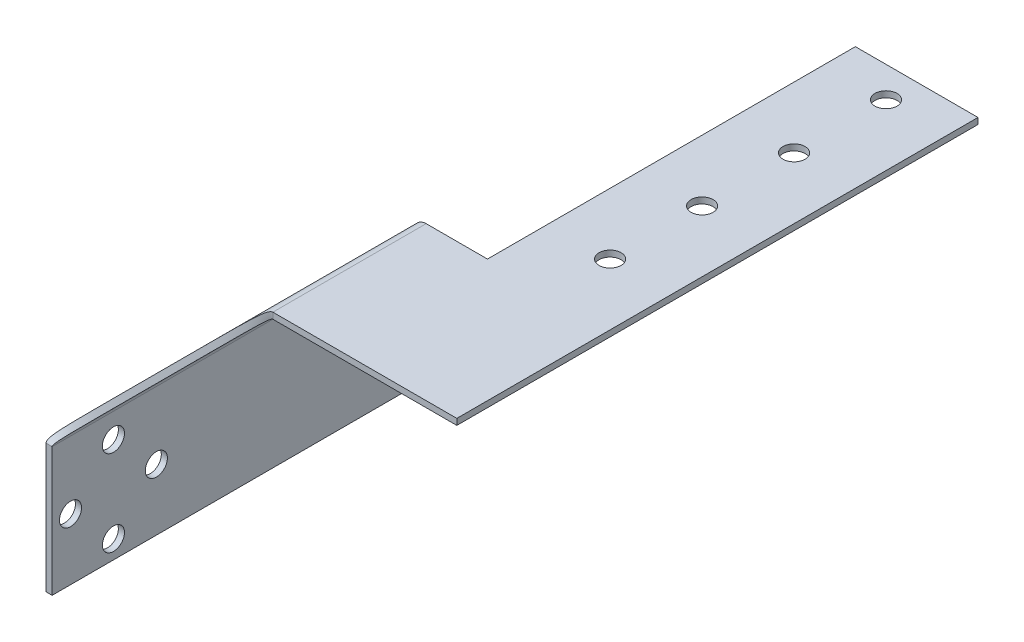
ISO-10303-21;
HEADER;
FILE_DESCRIPTION(('STEP AP214'),'2;1');
FILE_NAME('part.step','',(''),(''),'','','');
FILE_SCHEMA(('AUTOMOTIVE_DESIGN { 1 0 10303 214 1 1 1 1 }'));
ENDSEC;
DATA;
#1=APPLICATION_CONTEXT('core data for automotive mechanical design processes');
#2=APPLICATION_PROTOCOL_DEFINITION('international standard','automotive_design',2000,#1);
#3=PRODUCT_CONTEXT('',#1,'mechanical');
#4=PRODUCT('Part','Part','',(#3));
#5=PRODUCT_RELATED_PRODUCT_CATEGORY('part','',(#4));
#6=PRODUCT_DEFINITION_FORMATION('','',#4);
#7=PRODUCT_DEFINITION_CONTEXT('part definition',#1,'design');
#8=PRODUCT_DEFINITION('design','',#6,#7);
#9=PRODUCT_DEFINITION_SHAPE('','',#8);
#10=(LENGTH_UNIT() NAMED_UNIT(*) SI_UNIT(.MILLI.,.METRE.));
#11=(NAMED_UNIT(*) PLANE_ANGLE_UNIT() SI_UNIT($,.RADIAN.));
#12=(NAMED_UNIT(*) SI_UNIT($,.STERADIAN.) SOLID_ANGLE_UNIT());
#13=UNCERTAINTY_MEASURE_WITH_UNIT(LENGTH_MEASURE(1.E-05),#10,'distance_accuracy_value','');
#14=(GEOMETRIC_REPRESENTATION_CONTEXT(3) GLOBAL_UNCERTAINTY_ASSIGNED_CONTEXT((#13)) GLOBAL_UNIT_ASSIGNED_CONTEXT((#10,
#11,#12)) REPRESENTATION_CONTEXT('',''));
#15=CARTESIAN_POINT('',(0.,0.,0.));
#16=DIRECTION('',(0.,0.,1.));
#17=DIRECTION('',(1.,0.,0.));
#18=AXIS2_PLACEMENT_3D('',#15,#16,#17);
#19=CARTESIAN_POINT('',(0.,23.,-35.));
#20=DIRECTION('',(0.,0.,1.));
#21=DIRECTION('',(1.,0.,0.));
#22=AXIS2_PLACEMENT_3D('',#19,#20,#21);
#23=PLANE('',#22);
#24=CARTESIAN_POINT('',(2.,22.,-35.));
#25=CARTESIAN_POINT('',(2.,23.,-35.));
#26=B_SPLINE_CURVE_WITH_KNOTS('',1,(#24,#25),.UNSPECIFIED.,.F.,.F.,(2,2),(0.,1.),.UNSPECIFIED.);
#27=CARTESIAN_POINT('',(2.,22.,-35.));
#28=VERTEX_POINT('',#27);
#29=CARTESIAN_POINT('',(2.,23.,-35.));
#30=VERTEX_POINT('',#29);
#31=EDGE_CURVE('E12',#28,#30,#26,.T.);
#32=ORIENTED_EDGE('',*,*,#31,.F.);
#33=DIRECTION('',(1.,0.,0.));
#34=VECTOR('',#33,1.);
#35=CARTESIAN_POINT('',(0.,22.,-35.));
#36=LINE('',#35,#34);
#37=CARTESIAN_POINT('',(32.,22.,-35.));
#38=VERTEX_POINT('',#37);
#39=EDGE_CURVE('E271',#28,#38,#36,.T.);
#40=ORIENTED_EDGE('',*,*,#39,.T.);
#41=DIRECTION('',(0.,1.,0.));
#42=VECTOR('',#41,1.);
#43=CARTESIAN_POINT('',(32.,23.,-35.));
#44=LINE('',#43,#42);
#45=CARTESIAN_POINT('',(32.,23.,-35.));
#46=VERTEX_POINT('',#45);
#47=EDGE_CURVE('E65',#38,#46,#44,.T.);
#48=ORIENTED_EDGE('',*,*,#47,.T.);
#49=DIRECTION('',(1.,0.,0.));
#50=VECTOR('',#49,1.);
#51=CARTESIAN_POINT('',(0.,23.,-35.));
#52=LINE('',#51,#50);
#53=EDGE_CURVE('E290',#30,#46,#52,.T.);
#54=ORIENTED_EDGE('',*,*,#53,.F.);
#55=EDGE_LOOP('',(#32,#40,#48,#54));
#56=FACE_BOUND('',#55,.T.);
#57=ADVANCED_FACE('F53',(#56),#23,.T.);
#58=CARTESIAN_POINT('',(32.,23.,0.));
#59=DIRECTION('',(1.,0.,0.));
#60=DIRECTION('',(0.,0.,-1.));
#61=AXIS2_PLACEMENT_3D('',#58,#59,#60);
#62=PLANE('',#61);
#63=ORIENTED_EDGE('',*,*,#47,.F.);
#64=DIRECTION('',(0.,0.,1.));
#65=VECTOR('',#64,1.);
#66=CARTESIAN_POINT('',(32.,22.,0.));
#67=LINE('',#66,#65);
#68=CARTESIAN_POINT('',(32.,22.,-120.));
#69=VERTEX_POINT('',#68);
#70=EDGE_CURVE('E261',#38,#69,#67,.F.);
#71=ORIENTED_EDGE('',*,*,#70,.T.);
#72=DIRECTION('',(0.,1.,0.));
#73=VECTOR('',#72,1.);
#74=CARTESIAN_POINT('',(32.,23.,-120.));
#75=LINE('',#74,#73);
#76=CARTESIAN_POINT('',(32.,23.,-120.));
#77=VERTEX_POINT('',#76);
#78=EDGE_CURVE('E266',#69,#77,#75,.T.);
#79=ORIENTED_EDGE('',*,*,#78,.T.);
#80=DIRECTION('',(0.,0.,-1.));
#81=VECTOR('',#80,1.);
#82=CARTESIAN_POINT('',(32.,23.,0.));
#83=LINE('',#82,#81);
#84=EDGE_CURVE('E264',#46,#77,#83,.T.);
#85=ORIENTED_EDGE('',*,*,#84,.F.);
#86=EDGE_LOOP('',(#63,#71,#79,#85));
#87=FACE_BOUND('',#86,.T.);
#88=ADVANCED_FACE('F249',(#87),#62,.T.);
#89=CARTESIAN_POINT('',(0.,23.,-120.));
#90=DIRECTION('',(0.,0.,1.));
#91=DIRECTION('',(1.,0.,0.));
#92=AXIS2_PLACEMENT_3D('',#89,#90,#91);
#93=PLANE('',#92);
#94=ORIENTED_EDGE('',*,*,#78,.F.);
#95=DIRECTION('',(1.,0.,0.));
#96=VECTOR('',#95,1.);
#97=CARTESIAN_POINT('',(0.,22.,-120.));
#98=LINE('',#97,#96);
#99=CARTESIAN_POINT('',(12.,22.,-120.));
#100=VERTEX_POINT('',#99);
#101=EDGE_CURVE('E274',#100,#69,#98,.T.);
#102=ORIENTED_EDGE('',*,*,#101,.F.);
#103=DIRECTION('',(0.,1.,0.));
#104=VECTOR('',#103,1.);
#105=CARTESIAN_POINT('',(12.,23.,-120.));
#106=LINE('',#105,#104);
#107=CARTESIAN_POINT('',(12.,23.,-120.));
#108=VERTEX_POINT('',#107);
#109=EDGE_CURVE('E468',#100,#108,#106,.T.);
#110=ORIENTED_EDGE('',*,*,#109,.T.);
#111=DIRECTION('',(1.,0.,0.));
#112=VECTOR('',#111,1.);
#113=CARTESIAN_POINT('',(0.,23.,-120.));
#114=LINE('',#113,#112);
#115=EDGE_CURVE('E396',#108,#77,#114,.T.);
#116=ORIENTED_EDGE('',*,*,#115,.T.);
#117=EDGE_LOOP('',(#94,#102,#110,#116));
#118=FACE_BOUND('',#117,.T.);
#119=ADVANCED_FACE('F246',(#118),#93,.F.);
#120=CARTESIAN_POINT('',(12.,23.,0.));
#121=DIRECTION('',(1.,0.,0.));
#122=DIRECTION('',(0.,0.,-1.));
#123=AXIS2_PLACEMENT_3D('',#120,#121,#122);
#124=PLANE('',#123);
#125=ORIENTED_EDGE('',*,*,#109,.F.);
#126=DIRECTION('',(0.,0.,1.));
#127=VECTOR('',#126,1.);
#128=CARTESIAN_POINT('',(12.,22.,0.));
#129=LINE('',#128,#127);
#130=CARTESIAN_POINT('',(12.,22.,-60.));
#131=VERTEX_POINT('',#130);
#132=EDGE_CURVE('E278',#131,#100,#129,.F.);
#133=ORIENTED_EDGE('',*,*,#132,.F.);
#134=DIRECTION('',(0.,1.,0.));
#135=VECTOR('',#134,1.);
#136=CARTESIAN_POINT('',(12.,23.,-60.));
#137=LINE('',#136,#135);
#138=CARTESIAN_POINT('',(12.,23.,-60.));
#139=VERTEX_POINT('',#138);
#140=EDGE_CURVE('E466',#131,#139,#137,.T.);
#141=ORIENTED_EDGE('',*,*,#140,.T.);
#142=DIRECTION('',(0.,0.,-1.));
#143=VECTOR('',#142,1.);
#144=CARTESIAN_POINT('',(12.,23.,0.));
#145=LINE('',#144,#143);
#146=EDGE_CURVE('E382',#139,#108,#145,.T.);
#147=ORIENTED_EDGE('',*,*,#146,.T.);
#148=EDGE_LOOP('',(#125,#133,#141,#147));
#149=FACE_BOUND('',#148,.T.);
#150=ADVANCED_FACE('F242',(#149),#124,.F.);
#151=CARTESIAN_POINT('',(0.,23.,-60.));
#152=DIRECTION('',(0.,0.,1.));
#153=DIRECTION('',(1.,0.,0.));
#154=AXIS2_PLACEMENT_3D('',#151,#152,#153);
#155=PLANE('',#154);
#156=ORIENTED_EDGE('',*,*,#140,.F.);
#157=DIRECTION('',(1.,0.,0.));
#158=VECTOR('',#157,1.);
#159=CARTESIAN_POINT('',(0.,22.,-60.));
#160=LINE('',#159,#158);
#161=CARTESIAN_POINT('',(2.,22.,-60.));
#162=VERTEX_POINT('',#161);
#163=EDGE_CURVE('E276',#162,#131,#160,.T.);
#164=ORIENTED_EDGE('',*,*,#163,.F.);
#165=DIRECTION('',(0.,1.,0.));
#166=VECTOR('',#165,1.);
#167=CARTESIAN_POINT('',(2.,23.,-60.));
#168=LINE('',#167,#166);
#169=CARTESIAN_POINT('',(2.,23.,-60.));
#170=VERTEX_POINT('',#169);
#171=EDGE_CURVE('E469',#162,#170,#168,.T.);
#172=ORIENTED_EDGE('',*,*,#171,.T.);
#173=DIRECTION('',(1.,0.,0.));
#174=VECTOR('',#173,1.);
#175=CARTESIAN_POINT('',(0.,23.,-60.));
#176=LINE('',#175,#174);
#177=EDGE_CURVE('E386',#170,#139,#176,.T.);
#178=ORIENTED_EDGE('',*,*,#177,.T.);
#179=EDGE_LOOP('',(#156,#164,#172,#178));
#180=FACE_BOUND('',#179,.T.);
#181=ADVANCED_FACE('F239',(#180),#155,.F.);
#182=CARTESIAN_POINT('',(2.,21.,-60.));
#183=DIRECTION('',(0.,0.,-1.));
#184=DIRECTION('',(-1.,0.,0.));
#185=AXIS2_PLACEMENT_3D('',#182,#183,#184);
#186=PLANE('',#185);
#187=ORIENTED_EDGE('',*,*,#171,.F.);
#188=CARTESIAN_POINT('',(2.,21.,-60.));
#189=DIRECTION('',(0.,0.,-1.));
#190=DIRECTION('',(-1.,0.,0.));
#191=AXIS2_PLACEMENT_3D('',#188,#189,#190);
#192=CIRCLE('',#191,1.);
#193=CARTESIAN_POINT('',(1.,21.,-60.));
#194=VERTEX_POINT('',#193);
#195=EDGE_CURVE('E151',#162,#194,#192,.F.);
#196=ORIENTED_EDGE('',*,*,#195,.T.);
#197=DIRECTION('',(-1.,0.,0.));
#198=VECTOR('',#197,1.);
#199=CARTESIAN_POINT('',(0.,21.,-60.));
#200=LINE('',#199,#198);
#201=CARTESIAN_POINT('',(0.,21.,-60.));
#202=VERTEX_POINT('',#201);
#203=EDGE_CURVE('E73',#194,#202,#200,.T.);
#204=ORIENTED_EDGE('',*,*,#203,.T.);
#205=CARTESIAN_POINT('',(2.,21.,-60.));
#206=DIRECTION('',(0.,0.,1.));
#207=DIRECTION('',(1.,0.,0.));
#208=AXIS2_PLACEMENT_3D('',#205,#206,#207);
#209=CIRCLE('',#208,2.);
#210=EDGE_CURVE('E417',#170,#202,#209,.T.);
#211=ORIENTED_EDGE('',*,*,#210,.F.);
#212=EDGE_LOOP('',(#187,#196,#204,#211));
#213=FACE_BOUND('',#212,.T.);
#214=ADVANCED_FACE('F235',(#213),#186,.T.);
#215=CARTESIAN_POINT('',(0.,22.,-60.));
#216=DIRECTION('',(0.,0.,1.));
#217=DIRECTION('',(0.,-1.,0.));
#218=AXIS2_PLACEMENT_3D('',#215,#216,#217);
#219=PLANE('',#218);
#220=ORIENTED_EDGE('',*,*,#203,.F.);
#221=DIRECTION('',(0.,1.,0.));
#222=VECTOR('',#221,1.);
#223=CARTESIAN_POINT('',(1.,22.,-60.));
#224=LINE('',#223,#222);
#225=CARTESIAN_POINT('',(1.,0.,-60.));
#226=VERTEX_POINT('',#225);
#227=EDGE_CURVE('E142',#194,#226,#224,.F.);
#228=ORIENTED_EDGE('',*,*,#227,.T.);
#229=DIRECTION('',(-1.,0.,0.));
#230=VECTOR('',#229,1.);
#231=CARTESIAN_POINT('',(0.,0.,-60.));
#232=LINE('',#231,#230);
#233=CARTESIAN_POINT('',(0.,0.,-60.));
#234=VERTEX_POINT('',#233);
#235=EDGE_CURVE('E454',#226,#234,#232,.T.);
#236=ORIENTED_EDGE('',*,*,#235,.T.);
#237=DIRECTION('',(0.,-1.,0.));
#238=VECTOR('',#237,1.);
#239=CARTESIAN_POINT('',(0.,22.,-60.));
#240=LINE('',#239,#238);
#241=EDGE_CURVE('E413',#202,#234,#240,.T.);
#242=ORIENTED_EDGE('',*,*,#241,.F.);
#243=EDGE_LOOP('',(#220,#228,#236,#242));
#244=FACE_BOUND('',#243,.T.);
#245=ADVANCED_FACE('F231',(#244),#219,.F.);
#246=CARTESIAN_POINT('',(0.,0.,0.));
#247=DIRECTION('',(0.,1.,0.));
#248=DIRECTION('',(0.,0.,1.));
#249=AXIS2_PLACEMENT_3D('',#246,#247,#248);
#250=PLANE('',#249);
#251=ORIENTED_EDGE('',*,*,#235,.F.);
#252=DIRECTION('',(0.,0.,-1.));
#253=VECTOR('',#252,1.);
#254=CARTESIAN_POINT('',(1.,0.,0.));
#255=LINE('',#254,#253);
#256=CARTESIAN_POINT('',(1.,0.,0.));
#257=VERTEX_POINT('',#256);
#258=EDGE_CURVE('E156',#226,#257,#255,.F.);
#259=ORIENTED_EDGE('',*,*,#258,.T.);
#260=DIRECTION('',(-1.,0.,0.));
#261=VECTOR('',#260,1.);
#262=CARTESIAN_POINT('',(0.,0.,0.));
#263=LINE('',#262,#261);
#264=CARTESIAN_POINT('',(0.,0.,0.));
#265=VERTEX_POINT('',#264);
#266=EDGE_CURVE('E129',#257,#265,#263,.T.);
#267=ORIENTED_EDGE('',*,*,#266,.T.);
#268=DIRECTION('',(0.,0.,1.));
#269=VECTOR('',#268,1.);
#270=CARTESIAN_POINT('',(0.,0.,0.));
#271=LINE('',#270,#269);
#272=EDGE_CURVE('E409',#234,#265,#271,.T.);
#273=ORIENTED_EDGE('',*,*,#272,.F.);
#274=EDGE_LOOP('',(#251,#259,#267,#273));
#275=FACE_BOUND('',#274,.T.);
#276=ADVANCED_FACE('F227',(#275),#250,.F.);
#277=CARTESIAN_POINT('',(0.,22.,0.));
#278=DIRECTION('',(0.,0.,1.));
#279=DIRECTION('',(0.,-1.,0.));
#280=AXIS2_PLACEMENT_3D('',#277,#278,#279);
#281=PLANE('',#280);
#282=ORIENTED_EDGE('',*,*,#266,.F.);
#283=DIRECTION('',(0.,1.,0.));
#284=VECTOR('',#283,1.);
#285=CARTESIAN_POINT('',(1.,22.,0.));
#286=LINE('',#285,#284);
#287=CARTESIAN_POINT('',(1.,21.,0.));
#288=VERTEX_POINT('',#287);
#289=EDGE_CURVE('E139',#288,#257,#286,.F.);
#290=ORIENTED_EDGE('',*,*,#289,.F.);
#291=CARTESIAN_POINT('',(0.,21.,0.));
#292=CARTESIAN_POINT('',(1.,21.,0.));
#293=B_SPLINE_CURVE_WITH_KNOTS('',1,(#291,#292),.UNSPECIFIED.,.F.,.F.,(2,2),(0.,1.),.UNSPECIFIED.);
#294=CARTESIAN_POINT('',(0.,21.,0.));
#295=VERTEX_POINT('',#294);
#296=EDGE_CURVE('E114',#288,#295,#293,.F.);
#297=ORIENTED_EDGE('',*,*,#296,.T.);
#298=DIRECTION('',(0.,-1.,0.));
#299=VECTOR('',#298,1.);
#300=CARTESIAN_POINT('',(0.,22.,0.));
#301=LINE('',#300,#299);
#302=EDGE_CURVE('E412',#295,#265,#301,.T.);
#303=ORIENTED_EDGE('',*,*,#302,.T.);
#304=EDGE_LOOP('',(#282,#290,#297,#303));
#305=FACE_BOUND('',#304,.T.);
#306=ADVANCED_FACE('F154',(#305),#281,.T.);
#307=CARTESIAN_POINT('',(22.,23.,-115.));
#308=DIRECTION('',(0.,1.,0.));
#309=DIRECTION('',(0.,0.,1.));
#310=AXIS2_PLACEMENT_3D('',#307,#308,#309);
#311=CYLINDRICAL_SURFACE('',#310,1.8);
#312=CARTESIAN_POINT('',(22.,23.,-115.));
#313=DIRECTION('',(0.,1.,0.));
#314=DIRECTION('',(0.,0.,1.));
#315=AXIS2_PLACEMENT_3D('',#312,#313,#314);
#316=CIRCLE('',#315,1.8);
#317=CARTESIAN_POINT('',(22.,23.,-113.2));
#318=VERTEX_POINT('',#317);
#319=EDGE_CURVE('E418',#318,#318,#316,.T.);
#320=ORIENTED_EDGE('',*,*,#319,.T.);
#321=EDGE_LOOP('',(#320));
#322=FACE_BOUND('',#321,.T.);
#323=CARTESIAN_POINT('',(22.,22.,-115.));
#324=DIRECTION('',(0.,1.,0.));
#325=DIRECTION('',(0.,0.,1.));
#326=AXIS2_PLACEMENT_3D('',#323,#324,#325);
#327=CIRCLE('',#326,1.8);
#328=CARTESIAN_POINT('',(22.,22.,-113.2));
#329=VERTEX_POINT('',#328);
#330=EDGE_CURVE('E353',#329,#329,#327,.T.);
#331=ORIENTED_EDGE('',*,*,#330,.F.);
#332=EDGE_LOOP('',(#331));
#333=FACE_BOUND('',#332,.T.);
#334=ADVANCED_FACE('F184',(#322,#333),#311,.F.);
#335=CARTESIAN_POINT('',(22.,23.,-100.));
#336=DIRECTION('',(0.,1.,0.));
#337=DIRECTION('',(0.,0.,1.));
#338=AXIS2_PLACEMENT_3D('',#335,#336,#337);
#339=CYLINDRICAL_SURFACE('',#338,1.8);
#340=CARTESIAN_POINT('',(22.,23.,-100.));
#341=DIRECTION('',(0.,1.,0.));
#342=DIRECTION('',(0.,0.,1.));
#343=AXIS2_PLACEMENT_3D('',#340,#341,#342);
#344=CIRCLE('',#343,1.8);
#345=CARTESIAN_POINT('',(22.,23.,-98.2));
#346=VERTEX_POINT('',#345);
#347=EDGE_CURVE('E389',#346,#346,#344,.T.);
#348=ORIENTED_EDGE('',*,*,#347,.T.);
#349=EDGE_LOOP('',(#348));
#350=FACE_BOUND('',#349,.T.);
#351=CARTESIAN_POINT('',(22.,22.,-100.));
#352=DIRECTION('',(0.,1.,0.));
#353=DIRECTION('',(0.,0.,1.));
#354=AXIS2_PLACEMENT_3D('',#351,#352,#353);
#355=CIRCLE('',#354,1.8);
#356=CARTESIAN_POINT('',(22.,22.,-98.2));
#357=VERTEX_POINT('',#356);
#358=EDGE_CURVE('E360',#357,#357,#355,.T.);
#359=ORIENTED_EDGE('',*,*,#358,.F.);
#360=EDGE_LOOP('',(#359));
#361=FACE_BOUND('',#360,.T.);
#362=ADVANCED_FACE('F376',(#350,#361),#339,.F.);
#363=CARTESIAN_POINT('',(22.,23.,-85.));
#364=DIRECTION('',(0.,1.,0.));
#365=DIRECTION('',(0.,0.,1.));
#366=AXIS2_PLACEMENT_3D('',#363,#364,#365);
#367=CYLINDRICAL_SURFACE('',#366,1.80000000000001);
#368=CARTESIAN_POINT('',(22.,23.,-85.));
#369=DIRECTION('',(0.,1.,0.));
#370=DIRECTION('',(0.,0.,1.));
#371=AXIS2_PLACEMENT_3D('',#368,#369,#370);
#372=CIRCLE('',#371,1.80000000000001);
#373=CARTESIAN_POINT('',(22.,23.,-83.2));
#374=VERTEX_POINT('',#373);
#375=EDGE_CURVE('E383',#374,#374,#372,.T.);
#376=ORIENTED_EDGE('',*,*,#375,.T.);
#377=EDGE_LOOP('',(#376));
#378=FACE_BOUND('',#377,.T.);
#379=CARTESIAN_POINT('',(22.,22.,-85.));
#380=DIRECTION('',(0.,1.,0.));
#381=DIRECTION('',(0.,0.,1.));
#382=AXIS2_PLACEMENT_3D('',#379,#380,#381);
#383=CIRCLE('',#382,1.80000000000001);
#384=CARTESIAN_POINT('',(22.,22.,-83.2));
#385=VERTEX_POINT('',#384);
#386=EDGE_CURVE('E363',#385,#385,#383,.T.);
#387=ORIENTED_EDGE('',*,*,#386,.F.);
#388=EDGE_LOOP('',(#387));
#389=FACE_BOUND('',#388,.T.);
#390=ADVANCED_FACE('F371',(#378,#389),#367,.F.);
#391=CARTESIAN_POINT('',(22.,23.,-70.));
#392=DIRECTION('',(0.,1.,0.));
#393=DIRECTION('',(0.,0.,1.));
#394=AXIS2_PLACEMENT_3D('',#391,#392,#393);
#395=CYLINDRICAL_SURFACE('',#394,1.8);
#396=CARTESIAN_POINT('',(22.,23.,-70.));
#397=DIRECTION('',(0.,1.,0.));
#398=DIRECTION('',(0.,0.,1.));
#399=AXIS2_PLACEMENT_3D('',#396,#397,#398);
#400=CIRCLE('',#399,1.8);
#401=CARTESIAN_POINT('',(22.,23.,-68.2));
#402=VERTEX_POINT('',#401);
#403=EDGE_CURVE('E380',#402,#402,#400,.T.);
#404=ORIENTED_EDGE('',*,*,#403,.T.);
#405=EDGE_LOOP('',(#404));
#406=FACE_BOUND('',#405,.T.);
#407=CARTESIAN_POINT('',(22.,22.,-70.));
#408=DIRECTION('',(0.,1.,0.));
#409=DIRECTION('',(0.,0.,1.));
#410=AXIS2_PLACEMENT_3D('',#407,#408,#409);
#411=CIRCLE('',#410,1.8);
#412=CARTESIAN_POINT('',(22.,22.,-68.2));
#413=VERTEX_POINT('',#412);
#414=EDGE_CURVE('E356',#413,#413,#411,.T.);
#415=ORIENTED_EDGE('',*,*,#414,.F.);
#416=EDGE_LOOP('',(#415));
#417=FACE_BOUND('',#416,.T.);
#418=ADVANCED_FACE('F55',(#406,#417),#395,.F.);
#419=CARTESIAN_POINT('',(0.,17.,-9.99999999999999));
#420=DIRECTION('',(1.,0.,0.));
#421=DIRECTION('',(0.,0.,-1.));
#422=AXIS2_PLACEMENT_3D('',#419,#420,#421);
#423=CYLINDRICAL_SURFACE('',#422,1.8);
#424=CARTESIAN_POINT('',(0.,17.,-9.99999999999999));
#425=DIRECTION('',(-1.,0.,0.));
#426=DIRECTION('',(0.,0.,1.));
#427=AXIS2_PLACEMENT_3D('',#424,#425,#426);
#428=CIRCLE('',#427,1.8);
#429=CARTESIAN_POINT('',(0.,17.,-8.2));
#430=VERTEX_POINT('',#429);
#431=EDGE_CURVE('E399',#430,#430,#428,.T.);
#432=ORIENTED_EDGE('',*,*,#431,.T.);
#433=EDGE_LOOP('',(#432));
#434=FACE_BOUND('',#433,.T.);
#435=CARTESIAN_POINT('',(1.,17.,-9.99999999999999));
#436=DIRECTION('',(-1.,0.,0.));
#437=DIRECTION('',(0.,0.,1.));
#438=AXIS2_PLACEMENT_3D('',#435,#436,#437);
#439=CIRCLE('',#438,1.8);
#440=CARTESIAN_POINT('',(1.,17.,-8.2));
#441=VERTEX_POINT('',#440);
#442=EDGE_CURVE('E349',#441,#441,#439,.T.);
#443=ORIENTED_EDGE('',*,*,#442,.F.);
#444=EDGE_LOOP('',(#443));
#445=FACE_BOUND('',#444,.T.);
#446=ADVANCED_FACE('F322',(#434,#445),#423,.F.);
#447=CARTESIAN_POINT('',(0.,10.,-17.));
#448=DIRECTION('',(1.,0.,0.));
#449=DIRECTION('',(0.,0.,-1.));
#450=AXIS2_PLACEMENT_3D('',#447,#448,#449);
#451=CYLINDRICAL_SURFACE('',#450,1.8);
#452=CARTESIAN_POINT('',(0.,10.,-17.));
#453=DIRECTION('',(-1.,0.,0.));
#454=DIRECTION('',(0.,0.,1.));
#455=AXIS2_PLACEMENT_3D('',#452,#453,#454);
#456=CIRCLE('',#455,1.8);
#457=CARTESIAN_POINT('',(0.,10.,-15.2));
#458=VERTEX_POINT('',#457);
#459=EDGE_CURVE('E402',#458,#458,#456,.T.);
#460=ORIENTED_EDGE('',*,*,#459,.T.);
#461=EDGE_LOOP('',(#460));
#462=FACE_BOUND('',#461,.T.);
#463=CARTESIAN_POINT('',(1.,10.,-17.));
#464=DIRECTION('',(-1.,0.,0.));
#465=DIRECTION('',(0.,0.,1.));
#466=AXIS2_PLACEMENT_3D('',#463,#464,#465);
#467=CIRCLE('',#466,1.8);
#468=CARTESIAN_POINT('',(1.,10.,-15.2));
#469=VERTEX_POINT('',#468);
#470=EDGE_CURVE('E344',#469,#469,#467,.T.);
#471=ORIENTED_EDGE('',*,*,#470,.F.);
#472=EDGE_LOOP('',(#471));
#473=FACE_BOUND('',#472,.T.);
#474=ADVANCED_FACE('F325',(#462,#473),#451,.F.);
#475=CARTESIAN_POINT('',(0.,10.,-3.));
#476=DIRECTION('',(1.,0.,0.));
#477=DIRECTION('',(0.,0.,-1.));
#478=AXIS2_PLACEMENT_3D('',#475,#476,#477);
#479=CYLINDRICAL_SURFACE('',#478,1.8);
#480=CARTESIAN_POINT('',(0.,10.,-3.));
#481=DIRECTION('',(-1.,0.,0.));
#482=DIRECTION('',(0.,0.,1.));
#483=AXIS2_PLACEMENT_3D('',#480,#481,#482);
#484=CIRCLE('',#483,1.8);
#485=CARTESIAN_POINT('',(0.,10.,-1.2));
#486=VERTEX_POINT('',#485);
#487=EDGE_CURVE('E339',#486,#486,#484,.T.);
#488=ORIENTED_EDGE('',*,*,#487,.T.);
#489=EDGE_LOOP('',(#488));
#490=FACE_BOUND('',#489,.T.);
#491=CARTESIAN_POINT('',(1.,10.,-3.));
#492=DIRECTION('',(-1.,0.,0.));
#493=DIRECTION('',(0.,0.,1.));
#494=AXIS2_PLACEMENT_3D('',#491,#492,#493);
#495=CIRCLE('',#494,1.8);
#496=CARTESIAN_POINT('',(1.,10.,-1.2));
#497=VERTEX_POINT('',#496);
#498=EDGE_CURVE('E342',#497,#497,#495,.T.);
#499=ORIENTED_EDGE('',*,*,#498,.F.);
#500=EDGE_LOOP('',(#499));
#501=FACE_BOUND('',#500,.T.);
#502=ADVANCED_FACE('F328',(#490,#501),#479,.F.);
#503=CARTESIAN_POINT('',(0.,3.,-9.99999999999999));
#504=DIRECTION('',(1.,0.,0.));
#505=DIRECTION('',(0.,0.,-1.));
#506=AXIS2_PLACEMENT_3D('',#503,#504,#505);
#507=CYLINDRICAL_SURFACE('',#506,1.8);
#508=CARTESIAN_POINT('',(0.,3.,-9.99999999999999));
#509=DIRECTION('',(-1.,0.,0.));
#510=DIRECTION('',(0.,0.,1.));
#511=AXIS2_PLACEMENT_3D('',#508,#509,#510);
#512=CIRCLE('',#511,1.8);
#513=CARTESIAN_POINT('',(0.,3.,-8.19999999999999));
#514=VERTEX_POINT('',#513);
#515=EDGE_CURVE('E406',#514,#514,#512,.T.);
#516=ORIENTED_EDGE('',*,*,#515,.T.);
#517=EDGE_LOOP('',(#516));
#518=FACE_BOUND('',#517,.T.);
#519=CARTESIAN_POINT('',(1.,3.,-9.99999999999999));
#520=DIRECTION('',(-1.,0.,0.));
#521=DIRECTION('',(0.,0.,1.));
#522=AXIS2_PLACEMENT_3D('',#519,#520,#521);
#523=CIRCLE('',#522,1.8);
#524=CARTESIAN_POINT('',(1.,3.,-8.19999999999999));
#525=VERTEX_POINT('',#524);
#526=EDGE_CURVE('E159',#525,#525,#523,.T.);
#527=ORIENTED_EDGE('',*,*,#526,.F.);
#528=EDGE_LOOP('',(#527));
#529=FACE_BOUND('',#528,.T.);
#530=ADVANCED_FACE('F181',(#518,#529),#507,.F.);
#531=CARTESIAN_POINT('',(2.,23.,-35.));
#532=CARTESIAN_POINT('',(1.80338647388107,23.,-35.));
#533=CARTESIAN_POINT('',(1.6326093773315,22.9717056764427,-34.86328125));
#534=CARTESIAN_POINT('',(1.34199589270873,22.8946318214706,-34.3505859375));
#535=CARTESIAN_POINT('',(1.22202307719847,22.8457926109763,-33.974609375));
#536=CARTESIAN_POINT('',(1.02351196864741,22.7489052517995,-33.017578125));
#537=CARTESIAN_POINT('',(0.944794725634698,22.7007129597894,-32.4365234375));
#538=CARTESIAN_POINT('',(0.817642426928758,22.614903499298,-31.103515625));
#539=CARTESIAN_POINT('',(0.769158493570091,22.5771616142413,-30.3515625));
#540=CARTESIAN_POINT('',(0.655323307877943,22.4837394916937,-27.890625));
#541=CARTESIAN_POINT('',(0.620814178546581,22.4486023825566,-25.9765625));
#542=CARTESIAN_POINT('',(0.585680823817528,22.4143209185787,-21.875));
#543=CARTESIAN_POINT('',(0.585786437626905,22.4142135623731,-19.6875));
#544=CARTESIAN_POINT('',(0.585786437626905,22.4142135623731,-15.3125));
#545=CARTESIAN_POINT('',(0.585679081421307,22.4143191761825,-13.125));
#546=CARTESIAN_POINT('',(0.551397617443419,22.3791858214534,-9.0234375));
#547=CARTESIAN_POINT('',(0.516260508306251,22.3446766921221,-7.109375));
#548=CARTESIAN_POINT('',(0.422838385758663,22.2308415064299,-4.6484375));
#549=CARTESIAN_POINT('',(0.38509650070195,22.1823575730712,-3.896484375));
#550=CARTESIAN_POINT('',(0.299287040210591,22.0552052743653,-2.5634765625));
#551=CARTESIAN_POINT('',(0.251094748200532,21.9764880313526,-1.982421875));
#552=CARTESIAN_POINT('',(0.154207389023653,21.7779769228015,-1.025390625));
#553=CARTESIAN_POINT('',(0.105368178529392,21.6580041072913,-0.6494140625));
#554=CARTESIAN_POINT('',(0.0282943235572756,21.3673906226685,-0.13671875));
#555=CARTESIAN_POINT('',(0.,21.1966135261189,0.));
#556=CARTESIAN_POINT('',(0.,21.,0.));
#557=CARTESIAN_POINT('',(2.,22.,-35.));
#558=CARTESIAN_POINT('',(1.90169323694054,22.,-35.));
#559=CARTESIAN_POINT('',(1.81630468866575,21.9858528382214,-34.86328125));
#560=CARTESIAN_POINT('',(1.67099794635437,21.9473159107353,-34.3505859375));
#561=CARTESIAN_POINT('',(1.61101153859924,21.9228963054882,-33.974609375));
#562=CARTESIAN_POINT('',(1.51175598432371,21.8744526258997,-33.017578125));
#563=CARTESIAN_POINT('',(1.47239736281735,21.8503564798947,-32.4365234375));
#564=CARTESIAN_POINT('',(1.40882121346438,21.807451749649,-31.103515625));
#565=CARTESIAN_POINT('',(1.38457924678505,21.7885808071207,-30.3515625));
#566=CARTESIAN_POINT('',(1.32766165393897,21.7418697458469,-27.890625));
#567=CARTESIAN_POINT('',(1.31040708927329,21.7243011912783,-25.9765625));
#568=CARTESIAN_POINT('',(1.29284041190876,21.7071604592893,-21.875));
#569=CARTESIAN_POINT('',(1.29289321881345,21.7071067811865,-19.6875));
#570=CARTESIAN_POINT('',(1.29289321881345,21.7071067811865,-15.3125));
#571=CARTESIAN_POINT('',(1.29283954071065,21.7071595880912,-13.125));
#572=CARTESIAN_POINT('',(1.27569880872171,21.6895929107267,-9.0234375));
#573=CARTESIAN_POINT('',(1.25813025415313,21.672338346061,-7.109375));
#574=CARTESIAN_POINT('',(1.21141919287933,21.615420753215,-4.6484375));
#575=CARTESIAN_POINT('',(1.19254825035097,21.5911787865356,-3.896484375));
#576=CARTESIAN_POINT('',(1.1496435201053,21.5276026371826,-2.5634765625));
#577=CARTESIAN_POINT('',(1.12554737410027,21.4882440156763,-1.982421875));
#578=CARTESIAN_POINT('',(1.07710369451183,21.3889884614008,-1.025390625));
#579=CARTESIAN_POINT('',(1.0526840892647,21.3290020536456,-0.6494140625));
#580=CARTESIAN_POINT('',(1.01414716177864,21.1836953113342,-0.13671875));
#581=CARTESIAN_POINT('',(1.,21.0983067630595,0.));
#582=CARTESIAN_POINT('',(1.,21.,0.));
#583=B_SPLINE_SURFACE_WITH_KNOTS('',1,3,((#531,#532,#533,#534,#535,#536,#537,#538,#539,#540,
#541,#542,#543,#544,#545,#546,#547,#548,#549,#550,#551,#552,#553,#554,#555,#556),(#557,#558,
#559,#560,#561,#562,#563,#564,#565,#566,#567,#568,#569,#570,#571,#572,#573,#574,#575,#576,#577,
#578,#579,#580,#581,#582)),.UNSPECIFIED.,.F.,.F.,.F.,(2,2),(4,2,2,2,2,2,2,2,2,2,2,2,4),(0.,1.),
(0.,0.0625,0.125,0.1875,0.25,0.375,0.5,0.625,0.75,0.8125,0.875,0.9375,1.),.UNSPECIFIED.);
#584=CARTESIAN_POINT('',(1.,21.,0.));
#585=CARTESIAN_POINT('',(1.,21.0983067630595,0.));
#586=CARTESIAN_POINT('',(1.01414716177864,21.1836953113342,-0.13671875));
#587=CARTESIAN_POINT('',(1.0526840892647,21.3290020536456,-0.6494140625));
#588=CARTESIAN_POINT('',(1.07710369451183,21.3889884614008,-1.025390625));
#589=CARTESIAN_POINT('',(1.12554737410027,21.4882440156763,-1.982421875));
#590=CARTESIAN_POINT('',(1.1496435201053,21.5276026371826,-2.5634765625));
#591=CARTESIAN_POINT('',(1.19254825035097,21.5911787865356,-3.896484375));
#592=CARTESIAN_POINT('',(1.21141919287933,21.615420753215,-4.6484375));
#593=CARTESIAN_POINT('',(1.25813025415313,21.672338346061,-7.109375));
#594=CARTESIAN_POINT('',(1.27569880872171,21.6895929107267,-9.0234375));
#595=CARTESIAN_POINT('',(1.29283954071065,21.7071595880912,-13.125));
#596=CARTESIAN_POINT('',(1.29289321881345,21.7071067811865,-15.3125));
#597=CARTESIAN_POINT('',(1.29289321881345,21.7071067811865,-19.6875));
#598=CARTESIAN_POINT('',(1.29284041190876,21.7071604592893,-21.875));
#599=CARTESIAN_POINT('',(1.31040708927329,21.7243011912783,-25.9765625));
#600=CARTESIAN_POINT('',(1.32766165393897,21.7418697458469,-27.890625));
#601=CARTESIAN_POINT('',(1.38457924678505,21.7885808071207,-30.3515625));
#602=CARTESIAN_POINT('',(1.40882121346438,21.807451749649,-31.103515625));
#603=CARTESIAN_POINT('',(1.47239736281735,21.8503564798947,-32.4365234375));
#604=CARTESIAN_POINT('',(1.51175598432371,21.8744526258997,-33.017578125));
#605=CARTESIAN_POINT('',(1.61101153859924,21.9228963054882,-33.974609375));
#606=CARTESIAN_POINT('',(1.67099794635437,21.9473159107353,-34.3505859375));
#607=CARTESIAN_POINT('',(1.81630468866575,21.9858528382214,-34.86328125));
#608=CARTESIAN_POINT('',(1.90169323694054,22.,-35.));
#609=CARTESIAN_POINT('',(2.,22.,-35.));
#610=B_SPLINE_CURVE_WITH_KNOTS('',3,(#584,#585,#586,#587,#588,#589,#590,#591,#592,#593,#594,
#595,#596,#597,#598,#599,#600,#601,#602,#603,#604,#605,#606,#607,#608,#609),.UNSPECIFIED.,.F.,
.F.,(4,2,2,2,2,2,2,2,2,2,2,2,4),(0.,0.0625,0.125,0.1875,0.25,0.375,0.5,0.625,0.75,0.8125,0.875,
0.9375,1.),.UNSPECIFIED.);
#611=EDGE_CURVE('E118',#288,#28,#610,.T.);
#612=CARTESIAN_POINT('',(2.,23.,-35.));
#613=CARTESIAN_POINT('',(1.80338647388107,23.,-35.));
#614=CARTESIAN_POINT('',(1.6326093773315,22.9717056764427,-34.86328125));
#615=CARTESIAN_POINT('',(1.34199589270873,22.8946318214706,-34.3505859375));
#616=CARTESIAN_POINT('',(1.22202307719847,22.8457926109763,-33.974609375));
#617=CARTESIAN_POINT('',(1.02351196864741,22.7489052517995,-33.017578125));
#618=CARTESIAN_POINT('',(0.944794725634698,22.7007129597894,-32.4365234375));
#619=CARTESIAN_POINT('',(0.817642426928758,22.614903499298,-31.103515625));
#620=CARTESIAN_POINT('',(0.769158493570091,22.5771616142413,-30.3515625));
#621=CARTESIAN_POINT('',(0.655323307877943,22.4837394916937,-27.890625));
#622=CARTESIAN_POINT('',(0.620814178546581,22.4486023825566,-25.9765625));
#623=CARTESIAN_POINT('',(0.585680823817528,22.4143209185787,-21.875));
#624=CARTESIAN_POINT('',(0.585786437626905,22.4142135623731,-19.6875));
#625=CARTESIAN_POINT('',(0.585786437626905,22.4142135623731,-15.3125));
#626=CARTESIAN_POINT('',(0.585679081421307,22.4143191761825,-13.125));
#627=CARTESIAN_POINT('',(0.551397617443419,22.3791858214534,-9.0234375));
#628=CARTESIAN_POINT('',(0.516260508306251,22.3446766921221,-7.109375));
#629=CARTESIAN_POINT('',(0.422838385758663,22.2308415064299,-4.6484375));
#630=CARTESIAN_POINT('',(0.38509650070195,22.1823575730712,-3.896484375));
#631=CARTESIAN_POINT('',(0.299287040210591,22.0552052743653,-2.5634765625));
#632=CARTESIAN_POINT('',(0.251094748200532,21.9764880313526,-1.982421875));
#633=CARTESIAN_POINT('',(0.154207389023653,21.7779769228015,-1.025390625));
#634=CARTESIAN_POINT('',(0.105368178529392,21.6580041072913,-0.6494140625));
#635=CARTESIAN_POINT('',(0.0282943235572756,21.3673906226685,-0.13671875));
#636=CARTESIAN_POINT('',(0.,21.1966135261189,0.));
#637=CARTESIAN_POINT('',(0.,21.,0.));
#638=B_SPLINE_CURVE_WITH_KNOTS('',3,(#612,#613,#614,#615,#616,#617,#618,#619,#620,#621,#622,
#623,#624,#625,#626,#627,#628,#629,#630,#631,#632,#633,#634,#635,#636,#637),.UNSPECIFIED.,.F.,
.F.,(4,2,2,2,2,2,2,2,2,2,2,2,4),(0.,0.0625,0.125,0.1875,0.25,0.375,0.5,0.625,0.75,0.8125,0.875,
0.9375,1.),.UNSPECIFIED.);
#639=EDGE_CURVE('E121',#295,#30,#638,.F.);
#640=ORIENTED_EDGE('',*,*,#611,.T.);
#641=ORIENTED_EDGE('',*,*,#31,.T.);
#642=ORIENTED_EDGE('',*,*,#639,.F.);
#643=ORIENTED_EDGE('',*,*,#296,.F.);
#644=EDGE_LOOP('',(#640,#641,#642,#643));
#645=FACE_BOUND('',#644,.T.);
#646=ADVANCED_FACE('F116',(#645),#583,.F.);
#647=CARTESIAN_POINT('',(0.,22.,0.));
#648=DIRECTION('',(1.,0.,0.));
#649=DIRECTION('',(0.,0.,-1.));
#650=AXIS2_PLACEMENT_3D('',#647,#648,#649);
#651=PLANE('',#650);
#652=ORIENTED_EDGE('',*,*,#431,.F.);
#653=EDGE_LOOP('',(#652));
#654=FACE_BOUND('',#653,.T.);
#655=ORIENTED_EDGE('',*,*,#459,.F.);
#656=EDGE_LOOP('',(#655));
#657=FACE_BOUND('',#656,.T.);
#658=ORIENTED_EDGE('',*,*,#487,.F.);
#659=EDGE_LOOP('',(#658));
#660=FACE_BOUND('',#659,.T.);
#661=ORIENTED_EDGE('',*,*,#515,.F.);
#662=EDGE_LOOP('',(#661));
#663=FACE_BOUND('',#662,.T.);
#664=ORIENTED_EDGE('',*,*,#302,.F.);
#665=DIRECTION('',(0.,0.,1.));
#666=VECTOR('',#665,1.);
#667=CARTESIAN_POINT('',(0.,21.,-60.));
#668=LINE('',#667,#666);
#669=EDGE_CURVE('E130',#295,#202,#668,.F.);
#670=ORIENTED_EDGE('',*,*,#669,.T.);
#671=ORIENTED_EDGE('',*,*,#241,.T.);
#672=ORIENTED_EDGE('',*,*,#272,.T.);
#673=EDGE_LOOP('',(#664,#670,#671,#672));
#674=FACE_BOUND('',#673,.T.);
#675=ADVANCED_FACE('F180',(#654,#657,#660,#663,#674),#651,.F.);
#676=CARTESIAN_POINT('',(0.,23.,0.));
#677=DIRECTION('',(0.,1.,0.));
#678=DIRECTION('',(0.,0.,1.));
#679=AXIS2_PLACEMENT_3D('',#676,#677,#678);
#680=PLANE('',#679);
#681=ORIENTED_EDGE('',*,*,#319,.F.);
#682=EDGE_LOOP('',(#681));
#683=FACE_BOUND('',#682,.T.);
#684=ORIENTED_EDGE('',*,*,#347,.F.);
#685=EDGE_LOOP('',(#684));
#686=FACE_BOUND('',#685,.T.);
#687=ORIENTED_EDGE('',*,*,#375,.F.);
#688=EDGE_LOOP('',(#687));
#689=FACE_BOUND('',#688,.T.);
#690=ORIENTED_EDGE('',*,*,#403,.F.);
#691=EDGE_LOOP('',(#690));
#692=FACE_BOUND('',#691,.T.);
#693=ORIENTED_EDGE('',*,*,#177,.F.);
#694=DIRECTION('',(0.,0.,1.));
#695=VECTOR('',#694,1.);
#696=CARTESIAN_POINT('',(2.,23.,-35.));
#697=LINE('',#696,#695);
#698=EDGE_CURVE('E416',#170,#30,#697,.T.);
#699=ORIENTED_EDGE('',*,*,#698,.T.);
#700=ORIENTED_EDGE('',*,*,#53,.T.);
#701=ORIENTED_EDGE('',*,*,#84,.T.);
#702=ORIENTED_EDGE('',*,*,#115,.F.);
#703=ORIENTED_EDGE('',*,*,#146,.F.);
#704=EDGE_LOOP('',(#693,#699,#700,#701,#702,#703));
#705=FACE_BOUND('',#704,.T.);
#706=ADVANCED_FACE('F303',(#683,#686,#689,#692,#705),#680,.T.);
#707=CARTESIAN_POINT('',(2.,21.,0.));
#708=DIRECTION('',(0.,0.,-1.));
#709=DIRECTION('',(-1.,0.,0.));
#710=AXIS2_PLACEMENT_3D('',#707,#708,#709);
#711=CYLINDRICAL_SURFACE('',#710,2.);
#712=ORIENTED_EDGE('',*,*,#210,.T.);
#713=ORIENTED_EDGE('',*,*,#669,.F.);
#714=ORIENTED_EDGE('',*,*,#639,.T.);
#715=ORIENTED_EDGE('',*,*,#698,.F.);
#716=EDGE_LOOP('',(#712,#713,#714,#715));
#717=FACE_BOUND('',#716,.T.);
#718=ADVANCED_FACE('F293',(#717),#711,.T.);
#719=CARTESIAN_POINT('',(1.,22.,0.));
#720=DIRECTION('',(1.,0.,0.));
#721=DIRECTION('',(0.,0.,-1.));
#722=AXIS2_PLACEMENT_3D('',#719,#720,#721);
#723=PLANE('',#722);
#724=ORIENTED_EDGE('',*,*,#442,.T.);
#725=EDGE_LOOP('',(#724));
#726=FACE_BOUND('',#725,.T.);
#727=ORIENTED_EDGE('',*,*,#470,.T.);
#728=EDGE_LOOP('',(#727));
#729=FACE_BOUND('',#728,.T.);
#730=ORIENTED_EDGE('',*,*,#498,.T.);
#731=EDGE_LOOP('',(#730));
#732=FACE_BOUND('',#731,.T.);
#733=ORIENTED_EDGE('',*,*,#526,.T.);
#734=EDGE_LOOP('',(#733));
#735=FACE_BOUND('',#734,.T.);
#736=ORIENTED_EDGE('',*,*,#289,.T.);
#737=ORIENTED_EDGE('',*,*,#258,.F.);
#738=ORIENTED_EDGE('',*,*,#227,.F.);
#739=DIRECTION('',(0.,0.,-1.));
#740=VECTOR('',#739,1.);
#741=CARTESIAN_POINT('',(1.,21.,0.));
#742=LINE('',#741,#740);
#743=EDGE_CURVE('E136',#288,#194,#742,.T.);
#744=ORIENTED_EDGE('',*,*,#743,.F.);
#745=EDGE_LOOP('',(#736,#737,#738,#744));
#746=FACE_BOUND('',#745,.T.);
#747=ADVANCED_FACE('F137',(#726,#729,#732,#735,#746),#723,.T.);
#748=CARTESIAN_POINT('',(0.,22.,0.));
#749=DIRECTION('',(0.,1.,0.));
#750=DIRECTION('',(0.,0.,1.));
#751=AXIS2_PLACEMENT_3D('',#748,#749,#750);
#752=PLANE('',#751);
#753=ORIENTED_EDGE('',*,*,#330,.T.);
#754=EDGE_LOOP('',(#753));
#755=FACE_BOUND('',#754,.T.);
#756=ORIENTED_EDGE('',*,*,#358,.T.);
#757=EDGE_LOOP('',(#756));
#758=FACE_BOUND('',#757,.T.);
#759=ORIENTED_EDGE('',*,*,#386,.T.);
#760=EDGE_LOOP('',(#759));
#761=FACE_BOUND('',#760,.T.);
#762=ORIENTED_EDGE('',*,*,#414,.T.);
#763=EDGE_LOOP('',(#762));
#764=FACE_BOUND('',#763,.T.);
#765=ORIENTED_EDGE('',*,*,#163,.T.);
#766=ORIENTED_EDGE('',*,*,#132,.T.);
#767=ORIENTED_EDGE('',*,*,#101,.T.);
#768=ORIENTED_EDGE('',*,*,#70,.F.);
#769=ORIENTED_EDGE('',*,*,#39,.F.);
#770=DIRECTION('',(0.,0.,1.));
#771=VECTOR('',#770,1.);
#772=CARTESIAN_POINT('',(2.,22.,0.));
#773=LINE('',#772,#771);
#774=EDGE_CURVE('E145',#162,#28,#773,.T.);
#775=ORIENTED_EDGE('',*,*,#774,.F.);
#776=EDGE_LOOP('',(#765,#766,#767,#768,#769,#775));
#777=FACE_BOUND('',#776,.T.);
#778=ADVANCED_FACE('F270',(#755,#758,#761,#764,#777),#752,.F.);
#779=CARTESIAN_POINT('',(2.,21.,0.));
#780=DIRECTION('',(0.,0.,-1.));
#781=DIRECTION('',(-1.,0.,0.));
#782=AXIS2_PLACEMENT_3D('',#779,#780,#781);
#783=CYLINDRICAL_SURFACE('',#782,1.);
#784=ORIENTED_EDGE('',*,*,#195,.F.);
#785=ORIENTED_EDGE('',*,*,#774,.T.);
#786=ORIENTED_EDGE('',*,*,#611,.F.);
#787=ORIENTED_EDGE('',*,*,#743,.T.);
#788=EDGE_LOOP('',(#784,#785,#786,#787));
#789=FACE_BOUND('',#788,.T.);
#790=ADVANCED_FACE('F148',(#789),#783,.F.);
#791=CLOSED_SHELL('',(#57,#88,#119,#150,#181,#214,#245,#276,#306,#334,#362,#390,#418,#446,#474,
#502,#530,#646,#675,#706,#718,#747,#778,#790));
#792=MANIFOLD_SOLID_BREP('B2',#791);
#793=ADVANCED_BREP_SHAPE_REPRESENTATION('',(#18,#792),#14);
#794=SHAPE_DEFINITION_REPRESENTATION(#9,#793);
ENDSEC;
END-ISO-10303-21;
